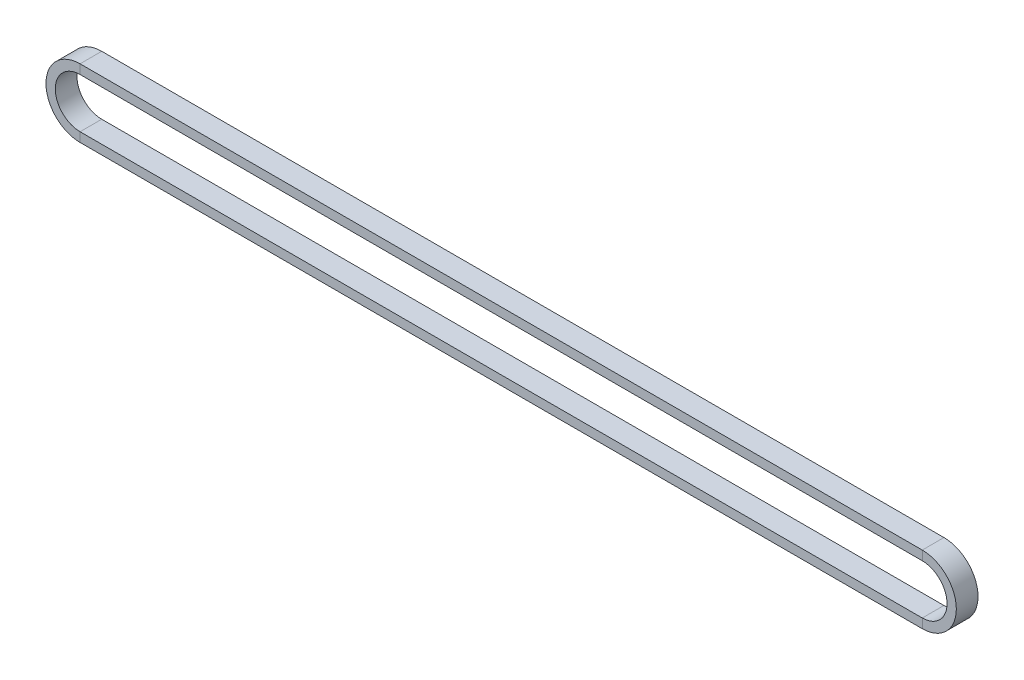
ISO-10303-21;
HEADER;
FILE_DESCRIPTION(('STEP AP214'),'2;1');
FILE_NAME('part.step','',(''),(''),'','','');
FILE_SCHEMA(('AUTOMOTIVE_DESIGN { 1 0 10303 214 1 1 1 1 }'));
ENDSEC;
DATA;
#1=APPLICATION_CONTEXT('core data for automotive mechanical design processes');
#2=APPLICATION_PROTOCOL_DEFINITION('international standard','automotive_design',2000,#1);
#3=PRODUCT_CONTEXT('',#1,'mechanical');
#4=PRODUCT('Part','Part','',(#3));
#5=PRODUCT_RELATED_PRODUCT_CATEGORY('part','',(#4));
#6=PRODUCT_DEFINITION_FORMATION('','',#4);
#7=PRODUCT_DEFINITION_CONTEXT('part definition',#1,'design');
#8=PRODUCT_DEFINITION('design','',#6,#7);
#9=PRODUCT_DEFINITION_SHAPE('','',#8);
#10=(LENGTH_UNIT() NAMED_UNIT(*) SI_UNIT(.MILLI.,.METRE.));
#11=(NAMED_UNIT(*) PLANE_ANGLE_UNIT() SI_UNIT($,.RADIAN.));
#12=(NAMED_UNIT(*) SI_UNIT($,.STERADIAN.) SOLID_ANGLE_UNIT());
#13=UNCERTAINTY_MEASURE_WITH_UNIT(LENGTH_MEASURE(1.E-05),#10,'distance_accuracy_value','');
#14=(GEOMETRIC_REPRESENTATION_CONTEXT(3) GLOBAL_UNCERTAINTY_ASSIGNED_CONTEXT((#13)) GLOBAL_UNIT_ASSIGNED_CONTEXT((#10,
#11,#12)) REPRESENTATION_CONTEXT('',''));
#15=CARTESIAN_POINT('',(0.,0.,0.));
#16=DIRECTION('',(0.,0.,1.));
#17=DIRECTION('',(1.,0.,0.));
#18=AXIS2_PLACEMENT_3D('',#15,#16,#17);
#19=CARTESIAN_POINT('',(-1360.,55.,-17.5));
#20=DIRECTION('',(0.,0.,1.));
#21=DIRECTION('',(1.,0.,0.));
#22=AXIS2_PLACEMENT_3D('',#19,#20,#21);
#23=PLANE('',#22);
#24=DIRECTION('',(0.,-1.,0.));
#25=VECTOR('',#24,1.);
#26=CARTESIAN_POINT('',(-1360.,55.,-17.5));
#27=LINE('',#26,#25);
#28=CARTESIAN_POINT('',(-1360.,55.,-17.5));
#29=VERTEX_POINT('',#28);
#30=CARTESIAN_POINT('',(-1360.,40.,-17.5));
#31=VERTEX_POINT('',#30);
#32=EDGE_CURVE('E156',#29,#31,#27,.T.);
#33=ORIENTED_EDGE('',*,*,#32,.F.);
#34=DIRECTION('',(1.,0.,0.));
#35=VECTOR('',#34,1.);
#36=CARTESIAN_POINT('',(-1360.,55.,-17.5));
#37=LINE('',#36,#35);
#38=CARTESIAN_POINT('',(0.,55.,-17.5));
#39=VERTEX_POINT('',#38);
#40=EDGE_CURVE('E155',#29,#39,#37,.T.);
#41=ORIENTED_EDGE('',*,*,#40,.T.);
#42=DIRECTION('',(0.,-1.,0.));
#43=VECTOR('',#42,1.);
#44=CARTESIAN_POINT('',(0.,55.,-17.5));
#45=LINE('',#44,#43);
#46=CARTESIAN_POINT('',(0.,40.,-17.5));
#47=VERTEX_POINT('',#46);
#48=EDGE_CURVE('E132',#39,#47,#45,.T.);
#49=ORIENTED_EDGE('',*,*,#48,.T.);
#50=DIRECTION('',(1.,0.,0.));
#51=VECTOR('',#50,1.);
#52=CARTESIAN_POINT('',(-1360.,40.,-17.5));
#53=LINE('',#52,#51);
#54=EDGE_CURVE('E161',#31,#47,#53,.T.);
#55=ORIENTED_EDGE('',*,*,#54,.F.);
#56=EDGE_LOOP('',(#33,#41,#49,#55));
#57=FACE_BOUND('',#56,.T.);
#58=ADVANCED_FACE('F37',(#57),#23,.F.);
#59=CARTESIAN_POINT('',(0.,55.,-17.5));
#60=DIRECTION('',(0.,0.,1.));
#61=DIRECTION('',(1.,0.,0.));
#62=AXIS2_PLACEMENT_3D('',#59,#60,#61);
#63=PLANE('',#62);
#64=CARTESIAN_POINT('',(0.,0.,-17.5));
#65=DIRECTION('',(0.,0.,-1.));
#66=DIRECTION('',(0.,1.,0.));
#67=AXIS2_PLACEMENT_3D('',#64,#65,#66);
#68=CIRCLE('',#67,40.);
#69=CARTESIAN_POINT('',(0.,-40.,-17.5));
#70=VERTEX_POINT('',#69);
#71=EDGE_CURVE('E122',#47,#70,#68,.T.);
#72=ORIENTED_EDGE('',*,*,#71,.F.);
#73=ORIENTED_EDGE('',*,*,#48,.F.);
#74=CARTESIAN_POINT('',(0.,0.,-17.5));
#75=DIRECTION('',(0.,0.,-1.));
#76=DIRECTION('',(0.,1.,0.));
#77=AXIS2_PLACEMENT_3D('',#74,#75,#76);
#78=CIRCLE('',#77,55.);
#79=CARTESIAN_POINT('',(0.,-55.,-17.5));
#80=VERTEX_POINT('',#79);
#81=EDGE_CURVE('E135',#39,#80,#78,.T.);
#82=ORIENTED_EDGE('',*,*,#81,.T.);
#83=DIRECTION('',(0.,1.,0.));
#84=VECTOR('',#83,1.);
#85=CARTESIAN_POINT('',(0.,-55.,-17.5));
#86=LINE('',#85,#84);
#87=EDGE_CURVE('E152',#80,#70,#86,.T.);
#88=ORIENTED_EDGE('',*,*,#87,.T.);
#89=EDGE_LOOP('',(#72,#73,#82,#88));
#90=FACE_BOUND('',#89,.T.);
#91=ADVANCED_FACE('F134',(#90),#63,.F.);
#92=CARTESIAN_POINT('',(0.,0.,0.));
#93=DIRECTION('',(0.,0.,-1.));
#94=DIRECTION('',(-1.,0.,0.));
#95=AXIS2_PLACEMENT_3D('',#92,#93,#94);
#96=CYLINDRICAL_SURFACE('',#95,40.);
#97=CARTESIAN_POINT('',(0.,0.,17.5));
#98=DIRECTION('',(0.,0.,-1.));
#99=DIRECTION('',(0.,1.,0.));
#100=AXIS2_PLACEMENT_3D('',#97,#98,#99);
#101=CIRCLE('',#100,40.);
#102=CARTESIAN_POINT('',(0.,40.,17.5));
#103=VERTEX_POINT('',#102);
#104=CARTESIAN_POINT('',(0.,-40.,17.5));
#105=VERTEX_POINT('',#104);
#106=EDGE_CURVE('E116',#103,#105,#101,.T.);
#107=ORIENTED_EDGE('',*,*,#106,.F.);
#108=DIRECTION('',(0.,0.,1.));
#109=VECTOR('',#108,1.);
#110=CARTESIAN_POINT('',(0.,40.,-17.5));
#111=LINE('',#110,#109);
#112=EDGE_CURVE('E141',#47,#103,#111,.T.);
#113=ORIENTED_EDGE('',*,*,#112,.F.);
#114=ORIENTED_EDGE('',*,*,#71,.T.);
#115=DIRECTION('',(0.,0.,1.));
#116=VECTOR('',#115,1.);
#117=CARTESIAN_POINT('',(0.,-40.,-17.5));
#118=LINE('',#117,#116);
#119=EDGE_CURVE('E219',#70,#105,#118,.T.);
#120=ORIENTED_EDGE('',*,*,#119,.T.);
#121=EDGE_LOOP('',(#107,#113,#114,#120));
#122=FACE_BOUND('',#121,.T.);
#123=ADVANCED_FACE('F248',(#122),#96,.F.);
#124=CARTESIAN_POINT('',(0.,55.,17.5));
#125=DIRECTION('',(0.,0.,-1.));
#126=DIRECTION('',(-1.,0.,0.));
#127=AXIS2_PLACEMENT_3D('',#124,#125,#126);
#128=PLANE('',#127);
#129=CARTESIAN_POINT('',(0.,0.,17.5));
#130=DIRECTION('',(0.,0.,-1.));
#131=DIRECTION('',(0.,1.,0.));
#132=AXIS2_PLACEMENT_3D('',#129,#130,#131);
#133=CIRCLE('',#132,55.);
#134=CARTESIAN_POINT('',(0.,55.,17.5));
#135=VERTEX_POINT('',#134);
#136=CARTESIAN_POINT('',(0.,-55.,17.5));
#137=VERTEX_POINT('',#136);
#138=EDGE_CURVE('E174',#135,#137,#133,.T.);
#139=ORIENTED_EDGE('',*,*,#138,.F.);
#140=DIRECTION('',(0.,1.,0.));
#141=VECTOR('',#140,1.);
#142=CARTESIAN_POINT('',(0.,55.,17.5));
#143=LINE('',#142,#141);
#144=EDGE_CURVE('E165',#103,#135,#143,.T.);
#145=ORIENTED_EDGE('',*,*,#144,.F.);
#146=ORIENTED_EDGE('',*,*,#106,.T.);
#147=DIRECTION('',(0.,-1.,0.));
#148=VECTOR('',#147,1.);
#149=CARTESIAN_POINT('',(0.,-55.,17.5));
#150=LINE('',#149,#148);
#151=EDGE_CURVE('E199',#105,#137,#150,.T.);
#152=ORIENTED_EDGE('',*,*,#151,.T.);
#153=EDGE_LOOP('',(#139,#145,#146,#152));
#154=FACE_BOUND('',#153,.T.);
#155=ADVANCED_FACE('F198',(#154),#128,.F.);
#156=CARTESIAN_POINT('',(0.,0.,0.));
#157=DIRECTION('',(0.,0.,-1.));
#158=DIRECTION('',(-1.,0.,0.));
#159=AXIS2_PLACEMENT_3D('',#156,#157,#158);
#160=CYLINDRICAL_SURFACE('',#159,55.);
#161=DIRECTION('',(0.,0.,-1.));
#162=VECTOR('',#161,1.);
#163=CARTESIAN_POINT('',(0.,-55.,-17.5));
#164=LINE('',#163,#162);
#165=EDGE_CURVE('E149',#137,#80,#164,.T.);
#166=ORIENTED_EDGE('',*,*,#165,.T.);
#167=ORIENTED_EDGE('',*,*,#81,.F.);
#168=DIRECTION('',(0.,0.,-1.));
#169=VECTOR('',#168,1.);
#170=CARTESIAN_POINT('',(0.,55.,-17.5));
#171=LINE('',#170,#169);
#172=EDGE_CURVE('E148',#135,#39,#171,.T.);
#173=ORIENTED_EDGE('',*,*,#172,.F.);
#174=ORIENTED_EDGE('',*,*,#138,.T.);
#175=EDGE_LOOP('',(#166,#167,#173,#174));
#176=FACE_BOUND('',#175,.T.);
#177=ADVANCED_FACE('F146',(#176),#160,.T.);
#178=CARTESIAN_POINT('',(0.,-55.,-17.5));
#179=DIRECTION('',(0.,0.,1.));
#180=DIRECTION('',(1.,0.,0.));
#181=AXIS2_PLACEMENT_3D('',#178,#179,#180);
#182=PLANE('',#181);
#183=DIRECTION('',(-1.,0.,0.));
#184=VECTOR('',#183,1.);
#185=CARTESIAN_POINT('',(0.,-40.,-17.5));
#186=LINE('',#185,#184);
#187=CARTESIAN_POINT('',(-1360.,-40.,-17.5));
#188=VERTEX_POINT('',#187);
#189=EDGE_CURVE('E103',#70,#188,#186,.T.);
#190=ORIENTED_EDGE('',*,*,#189,.F.);
#191=ORIENTED_EDGE('',*,*,#87,.F.);
#192=DIRECTION('',(-1.,0.,0.));
#193=VECTOR('',#192,1.);
#194=CARTESIAN_POINT('',(0.,-55.,-17.5));
#195=LINE('',#194,#193);
#196=CARTESIAN_POINT('',(-1360.,-55.,-17.5));
#197=VERTEX_POINT('',#196);
#198=EDGE_CURVE('E173',#80,#197,#195,.T.);
#199=ORIENTED_EDGE('',*,*,#198,.T.);
#200=DIRECTION('',(0.,1.,0.));
#201=VECTOR('',#200,1.);
#202=CARTESIAN_POINT('',(-1360.,-55.,-17.5));
#203=LINE('',#202,#201);
#204=EDGE_CURVE('E235',#197,#188,#203,.T.);
#205=ORIENTED_EDGE('',*,*,#204,.T.);
#206=EDGE_LOOP('',(#190,#191,#199,#205));
#207=FACE_BOUND('',#206,.T.);
#208=ADVANCED_FACE('F244',(#207),#182,.F.);
#209=CARTESIAN_POINT('',(0.,-40.,-17.5));
#210=DIRECTION('',(0.,-1.,0.));
#211=DIRECTION('',(0.,0.,-1.));
#212=AXIS2_PLACEMENT_3D('',#209,#210,#211);
#213=PLANE('',#212);
#214=DIRECTION('',(-1.,0.,0.));
#215=VECTOR('',#214,1.);
#216=CARTESIAN_POINT('',(0.,-40.,17.5));
#217=LINE('',#216,#215);
#218=CARTESIAN_POINT('',(-1360.,-40.,17.5));
#219=VERTEX_POINT('',#218);
#220=EDGE_CURVE('E96',#105,#219,#217,.T.);
#221=ORIENTED_EDGE('',*,*,#220,.F.);
#222=ORIENTED_EDGE('',*,*,#119,.F.);
#223=ORIENTED_EDGE('',*,*,#189,.T.);
#224=DIRECTION('',(0.,0.,1.));
#225=VECTOR('',#224,1.);
#226=CARTESIAN_POINT('',(-1360.,-40.,-17.5));
#227=LINE('',#226,#225);
#228=EDGE_CURVE('E214',#188,#219,#227,.T.);
#229=ORIENTED_EDGE('',*,*,#228,.T.);
#230=EDGE_LOOP('',(#221,#222,#223,#229));
#231=FACE_BOUND('',#230,.T.);
#232=ADVANCED_FACE('F247',(#231),#213,.F.);
#233=CARTESIAN_POINT('',(0.,-55.,17.5));
#234=DIRECTION('',(0.,0.,-1.));
#235=DIRECTION('',(-1.,0.,0.));
#236=AXIS2_PLACEMENT_3D('',#233,#234,#235);
#237=PLANE('',#236);
#238=DIRECTION('',(-1.,0.,0.));
#239=VECTOR('',#238,1.);
#240=CARTESIAN_POINT('',(0.,-55.,17.5));
#241=LINE('',#240,#239);
#242=CARTESIAN_POINT('',(-1360.,-55.,17.5));
#243=VERTEX_POINT('',#242);
#244=EDGE_CURVE('E87',#137,#243,#241,.T.);
#245=ORIENTED_EDGE('',*,*,#244,.F.);
#246=ORIENTED_EDGE('',*,*,#151,.F.);
#247=ORIENTED_EDGE('',*,*,#220,.T.);
#248=DIRECTION('',(0.,-1.,0.));
#249=VECTOR('',#248,1.);
#250=CARTESIAN_POINT('',(-1360.,-55.,17.5));
#251=LINE('',#250,#249);
#252=EDGE_CURVE('E182',#219,#243,#251,.T.);
#253=ORIENTED_EDGE('',*,*,#252,.T.);
#254=EDGE_LOOP('',(#245,#246,#247,#253));
#255=FACE_BOUND('',#254,.T.);
#256=ADVANCED_FACE('F266',(#255),#237,.F.);
#257=CARTESIAN_POINT('',(0.,-55.,-17.5));
#258=DIRECTION('',(0.,1.,0.));
#259=DIRECTION('',(0.,0.,1.));
#260=AXIS2_PLACEMENT_3D('',#257,#258,#259);
#261=PLANE('',#260);
#262=DIRECTION('',(0.,0.,-1.));
#263=VECTOR('',#262,1.);
#264=CARTESIAN_POINT('',(-1360.,-55.,-17.5));
#265=LINE('',#264,#263);
#266=EDGE_CURVE('E175',#243,#197,#265,.T.);
#267=ORIENTED_EDGE('',*,*,#266,.T.);
#268=ORIENTED_EDGE('',*,*,#198,.F.);
#269=ORIENTED_EDGE('',*,*,#165,.F.);
#270=ORIENTED_EDGE('',*,*,#244,.T.);
#271=EDGE_LOOP('',(#267,#268,#269,#270));
#272=FACE_BOUND('',#271,.T.);
#273=ADVANCED_FACE('F258',(#272),#261,.F.);
#274=CARTESIAN_POINT('',(-1360.,-55.,-17.5));
#275=DIRECTION('',(0.,0.,1.));
#276=DIRECTION('',(1.,0.,0.));
#277=AXIS2_PLACEMENT_3D('',#274,#275,#276);
#278=PLANE('',#277);
#279=CARTESIAN_POINT('',(-1360.,0.,-17.5));
#280=DIRECTION('',(0.,0.,-1.));
#281=DIRECTION('',(0.,-1.,0.));
#282=AXIS2_PLACEMENT_3D('',#279,#280,#281);
#283=CIRCLE('',#282,40.);
#284=EDGE_CURVE('E211',#188,#31,#283,.T.);
#285=ORIENTED_EDGE('',*,*,#284,.F.);
#286=ORIENTED_EDGE('',*,*,#204,.F.);
#287=CARTESIAN_POINT('',(-1360.,0.,-17.5));
#288=DIRECTION('',(0.,0.,-1.));
#289=DIRECTION('',(0.,-1.,0.));
#290=AXIS2_PLACEMENT_3D('',#287,#288,#289);
#291=CIRCLE('',#290,55.);
#292=EDGE_CURVE('E177',#197,#29,#291,.T.);
#293=ORIENTED_EDGE('',*,*,#292,.T.);
#294=ORIENTED_EDGE('',*,*,#32,.T.);
#295=EDGE_LOOP('',(#285,#286,#293,#294));
#296=FACE_BOUND('',#295,.T.);
#297=ADVANCED_FACE('F256',(#296),#278,.F.);
#298=CARTESIAN_POINT('',(-1360.,0.,0.));
#299=DIRECTION('',(0.,0.,-1.));
#300=DIRECTION('',(-1.,0.,0.));
#301=AXIS2_PLACEMENT_3D('',#298,#299,#300);
#302=CYLINDRICAL_SURFACE('',#301,40.);
#303=CARTESIAN_POINT('',(-1360.,0.,17.5));
#304=DIRECTION('',(0.,0.,-1.));
#305=DIRECTION('',(0.,-1.,0.));
#306=AXIS2_PLACEMENT_3D('',#303,#304,#305);
#307=CIRCLE('',#306,40.);
#308=CARTESIAN_POINT('',(-1360.,40.,17.5));
#309=VERTEX_POINT('',#308);
#310=EDGE_CURVE('E63',#219,#309,#307,.T.);
#311=ORIENTED_EDGE('',*,*,#310,.F.);
#312=ORIENTED_EDGE('',*,*,#228,.F.);
#313=ORIENTED_EDGE('',*,*,#284,.T.);
#314=DIRECTION('',(0.,0.,1.));
#315=VECTOR('',#314,1.);
#316=CARTESIAN_POINT('',(-1360.,40.,-17.5));
#317=LINE('',#316,#315);
#318=EDGE_CURVE('E208',#31,#309,#317,.T.);
#319=ORIENTED_EDGE('',*,*,#318,.T.);
#320=EDGE_LOOP('',(#311,#312,#313,#319));
#321=FACE_BOUND('',#320,.T.);
#322=ADVANCED_FACE('F253',(#321),#302,.F.);
#323=CARTESIAN_POINT('',(-1360.,-55.,17.5));
#324=DIRECTION('',(0.,0.,-1.));
#325=DIRECTION('',(-1.,0.,0.));
#326=AXIS2_PLACEMENT_3D('',#323,#324,#325);
#327=PLANE('',#326);
#328=CARTESIAN_POINT('',(-1360.,0.,17.5));
#329=DIRECTION('',(0.,0.,-1.));
#330=DIRECTION('',(0.,-1.,0.));
#331=AXIS2_PLACEMENT_3D('',#328,#329,#330);
#332=CIRCLE('',#331,55.);
#333=CARTESIAN_POINT('',(-1360.,55.,17.5));
#334=VERTEX_POINT('',#333);
#335=EDGE_CURVE('E55',#243,#334,#332,.T.);
#336=ORIENTED_EDGE('',*,*,#335,.F.);
#337=ORIENTED_EDGE('',*,*,#252,.F.);
#338=ORIENTED_EDGE('',*,*,#310,.T.);
#339=DIRECTION('',(0.,1.,0.));
#340=VECTOR('',#339,1.);
#341=CARTESIAN_POINT('',(-1360.,55.,17.5));
#342=LINE('',#341,#340);
#343=EDGE_CURVE('E188',#309,#334,#342,.T.);
#344=ORIENTED_EDGE('',*,*,#343,.T.);
#345=EDGE_LOOP('',(#336,#337,#338,#344));
#346=FACE_BOUND('',#345,.T.);
#347=ADVANCED_FACE('F264',(#346),#327,.F.);
#348=CARTESIAN_POINT('',(-1360.,0.,0.));
#349=DIRECTION('',(0.,0.,-1.));
#350=DIRECTION('',(-1.,0.,0.));
#351=AXIS2_PLACEMENT_3D('',#348,#349,#350);
#352=CYLINDRICAL_SURFACE('',#351,55.);
#353=DIRECTION('',(0.,0.,-1.));
#354=VECTOR('',#353,1.);
#355=CARTESIAN_POINT('',(-1360.,55.,-17.5));
#356=LINE('',#355,#354);
#357=EDGE_CURVE('E41',#334,#29,#356,.T.);
#358=ORIENTED_EDGE('',*,*,#357,.T.);
#359=ORIENTED_EDGE('',*,*,#292,.F.);
#360=ORIENTED_EDGE('',*,*,#266,.F.);
#361=ORIENTED_EDGE('',*,*,#335,.T.);
#362=EDGE_LOOP('',(#358,#359,#360,#361));
#363=FACE_BOUND('',#362,.T.);
#364=ADVANCED_FACE('F192',(#363),#352,.T.);
#365=CARTESIAN_POINT('',(-1360.,40.,-17.5));
#366=DIRECTION('',(0.,1.,0.));
#367=DIRECTION('',(0.,0.,1.));
#368=AXIS2_PLACEMENT_3D('',#365,#366,#367);
#369=PLANE('',#368);
#370=ORIENTED_EDGE('',*,*,#54,.T.);
#371=ORIENTED_EDGE('',*,*,#112,.T.);
#372=DIRECTION('',(1.,0.,0.));
#373=VECTOR('',#372,1.);
#374=CARTESIAN_POINT('',(-1360.,40.,17.5));
#375=LINE('',#374,#373);
#376=EDGE_CURVE('E47',#309,#103,#375,.T.);
#377=ORIENTED_EDGE('',*,*,#376,.F.);
#378=ORIENTED_EDGE('',*,*,#318,.F.);
#379=EDGE_LOOP('',(#370,#371,#377,#378));
#380=FACE_BOUND('',#379,.T.);
#381=ADVANCED_FACE('F250',(#380),#369,.F.);
#382=CARTESIAN_POINT('',(-1360.,55.,17.5));
#383=DIRECTION('',(0.,0.,-1.));
#384=DIRECTION('',(-1.,0.,0.));
#385=AXIS2_PLACEMENT_3D('',#382,#383,#384);
#386=PLANE('',#385);
#387=ORIENTED_EDGE('',*,*,#376,.T.);
#388=ORIENTED_EDGE('',*,*,#144,.T.);
#389=DIRECTION('',(1.,0.,0.));
#390=VECTOR('',#389,1.);
#391=CARTESIAN_POINT('',(-1360.,55.,17.5));
#392=LINE('',#391,#390);
#393=EDGE_CURVE('E11',#334,#135,#392,.T.);
#394=ORIENTED_EDGE('',*,*,#393,.F.);
#395=ORIENTED_EDGE('',*,*,#343,.F.);
#396=EDGE_LOOP('',(#387,#388,#394,#395));
#397=FACE_BOUND('',#396,.T.);
#398=ADVANCED_FACE('F196',(#397),#386,.F.);
#399=CARTESIAN_POINT('',(-1360.,55.,-17.5));
#400=DIRECTION('',(0.,-1.,0.));
#401=DIRECTION('',(0.,0.,-1.));
#402=AXIS2_PLACEMENT_3D('',#399,#400,#401);
#403=PLANE('',#402);
#404=ORIENTED_EDGE('',*,*,#393,.T.);
#405=ORIENTED_EDGE('',*,*,#172,.T.);
#406=ORIENTED_EDGE('',*,*,#40,.F.);
#407=ORIENTED_EDGE('',*,*,#357,.F.);
#408=EDGE_LOOP('',(#404,#405,#406,#407));
#409=FACE_BOUND('',#408,.T.);
#410=ADVANCED_FACE('F39',(#409),#403,.F.);
#411=CLOSED_SHELL('',(#58,#91,#123,#155,#177,#208,#232,#256,#273,#297,#322,#347,#364,#381,#398,#410));
#412=MANIFOLD_SOLID_BREP('B2',#411);
#413=ADVANCED_BREP_SHAPE_REPRESENTATION('',(#18,#412),#14);
#414=SHAPE_DEFINITION_REPRESENTATION(#9,#413);
ENDSEC;
END-ISO-10303-21;
